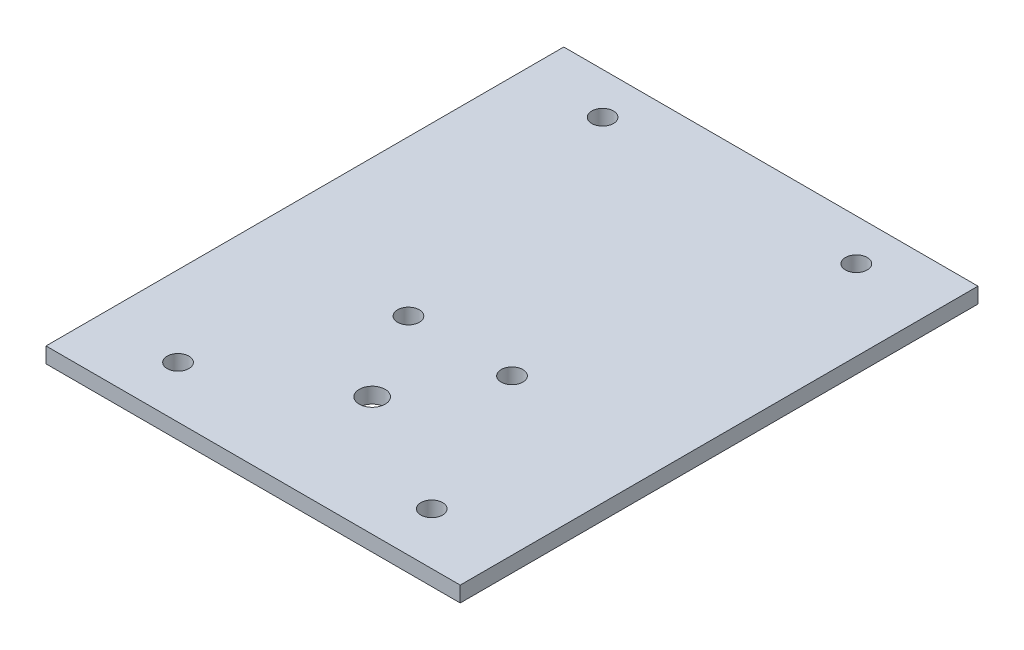
ISO-10303-21;
HEADER;
FILE_DESCRIPTION(('STEP AP214'),'2;1');
FILE_NAME('part.step','',(''),(''),'','','');
FILE_SCHEMA(('AUTOMOTIVE_DESIGN { 1 0 10303 214 1 1 1 1 }'));
ENDSEC;
DATA;
#1=APPLICATION_CONTEXT('core data for automotive mechanical design processes');
#2=APPLICATION_PROTOCOL_DEFINITION('international standard','automotive_design',2000,#1);
#3=PRODUCT_CONTEXT('',#1,'mechanical');
#4=PRODUCT('Part','Part','',(#3));
#5=PRODUCT_RELATED_PRODUCT_CATEGORY('part','',(#4));
#6=PRODUCT_DEFINITION_FORMATION('','',#4);
#7=PRODUCT_DEFINITION_CONTEXT('part definition',#1,'design');
#8=PRODUCT_DEFINITION('design','',#6,#7);
#9=PRODUCT_DEFINITION_SHAPE('','',#8);
#10=(LENGTH_UNIT() NAMED_UNIT(*) SI_UNIT(.MILLI.,.METRE.));
#11=(NAMED_UNIT(*) PLANE_ANGLE_UNIT() SI_UNIT($,.RADIAN.));
#12=(NAMED_UNIT(*) SI_UNIT($,.STERADIAN.) SOLID_ANGLE_UNIT());
#13=UNCERTAINTY_MEASURE_WITH_UNIT(LENGTH_MEASURE(1.E-05),#10,'distance_accuracy_value','');
#14=(GEOMETRIC_REPRESENTATION_CONTEXT(3) GLOBAL_UNCERTAINTY_ASSIGNED_CONTEXT((#13)) GLOBAL_UNIT_ASSIGNED_CONTEXT((#10,
#11,#12)) REPRESENTATION_CONTEXT('',''));
#15=CARTESIAN_POINT('',(0.,0.,0.));
#16=DIRECTION('',(0.,0.,1.));
#17=DIRECTION('',(1.,0.,0.));
#18=AXIS2_PLACEMENT_3D('',#15,#16,#17);
#19=CARTESIAN_POINT('',(0.,3.,0.));
#20=DIRECTION('',(0.,1.,0.));
#21=DIRECTION('',(0.,0.,1.));
#22=AXIS2_PLACEMENT_3D('',#19,#20,#21);
#23=PLANE('',#22);
#24=CARTESIAN_POINT('',(10.,3.,10.));
#25=DIRECTION('',(0.,1.,0.));
#26=DIRECTION('',(0.,0.,1.));
#27=AXIS2_PLACEMENT_3D('',#24,#25,#26);
#28=CIRCLE('',#27,2.1);
#29=CARTESIAN_POINT('',(10.,3.,12.1));
#30=VERTEX_POINT('',#29);
#31=EDGE_CURVE('E139',#30,#30,#28,.T.);
#32=ORIENTED_EDGE('',*,*,#31,.F.);
#33=EDGE_LOOP('',(#32));
#34=FACE_BOUND('',#33,.T.);
#35=CARTESIAN_POINT('',(24.5,3.,40.));
#36=DIRECTION('',(0.,1.,0.));
#37=DIRECTION('',(0.,0.,1.));
#38=AXIS2_PLACEMENT_3D('',#35,#36,#37);
#39=CIRCLE('',#38,2.1);
#40=CARTESIAN_POINT('',(24.5,3.,42.1));
#41=VERTEX_POINT('',#40);
#42=EDGE_CURVE('E127',#41,#41,#39,.T.);
#43=ORIENTED_EDGE('',*,*,#42,.F.);
#44=EDGE_LOOP('',(#43));
#45=FACE_BOUND('',#44,.T.);
#46=CARTESIAN_POINT('',(-24.5,3.,-42.));
#47=DIRECTION('',(0.,1.,0.));
#48=DIRECTION('',(0.,0.,1.));
#49=AXIS2_PLACEMENT_3D('',#46,#47,#48);
#50=CIRCLE('',#49,2.1);
#51=CARTESIAN_POINT('',(-24.5,3.,-39.9));
#52=VERTEX_POINT('',#51);
#53=EDGE_CURVE('E115',#52,#52,#50,.T.);
#54=ORIENTED_EDGE('',*,*,#53,.F.);
#55=EDGE_LOOP('',(#54));
#56=FACE_BOUND('',#55,.T.);
#57=DIRECTION('',(0.,0.,-1.));
#58=VECTOR('',#57,1.);
#59=CARTESIAN_POINT('',(40.,3.,-50.));
#60=LINE('',#59,#58);
#61=CARTESIAN_POINT('',(40.,3.,50.));
#62=VERTEX_POINT('',#61);
#63=CARTESIAN_POINT('',(40.,3.,-50.));
#64=VERTEX_POINT('',#63);
#65=EDGE_CURVE('E85',#62,#64,#60,.T.);
#66=ORIENTED_EDGE('',*,*,#65,.T.);
#67=DIRECTION('',(-1.,0.,0.));
#68=VECTOR('',#67,1.);
#69=CARTESIAN_POINT('',(-40.,3.,-50.));
#70=LINE('',#69,#68);
#71=CARTESIAN_POINT('',(-40.,3.,-50.));
#72=VERTEX_POINT('',#71);
#73=EDGE_CURVE('E80',#64,#72,#70,.T.);
#74=ORIENTED_EDGE('',*,*,#73,.T.);
#75=DIRECTION('',(0.,0.,1.));
#76=VECTOR('',#75,1.);
#77=CARTESIAN_POINT('',(-40.,3.,-50.));
#78=LINE('',#77,#76);
#79=CARTESIAN_POINT('',(-40.,3.,50.));
#80=VERTEX_POINT('',#79);
#81=EDGE_CURVE('E83',#72,#80,#78,.T.);
#82=ORIENTED_EDGE('',*,*,#81,.T.);
#83=DIRECTION('',(1.,0.,0.));
#84=VECTOR('',#83,1.);
#85=CARTESIAN_POINT('',(-40.,3.,50.));
#86=LINE('',#85,#84);
#87=EDGE_CURVE('E50',#80,#62,#86,.T.);
#88=ORIENTED_EDGE('',*,*,#87,.T.);
#89=EDGE_LOOP('',(#66,#74,#82,#88));
#90=FACE_BOUND('',#89,.T.);
#91=CARTESIAN_POINT('',(0.,3.,27.));
#92=DIRECTION('',(0.,1.,0.));
#93=DIRECTION('',(0.,0.,1.));
#94=AXIS2_PLACEMENT_3D('',#91,#92,#93);
#95=CIRCLE('',#94,2.5);
#96=CARTESIAN_POINT('',(0.,3.,29.5));
#97=VERTEX_POINT('',#96);
#98=EDGE_CURVE('E100',#97,#97,#95,.T.);
#99=ORIENTED_EDGE('',*,*,#98,.F.);
#100=EDGE_LOOP('',(#99));
#101=FACE_BOUND('',#100,.T.);
#102=CARTESIAN_POINT('',(24.5,3.,-42.));
#103=DIRECTION('',(0.,1.,0.));
#104=DIRECTION('',(0.,0.,-1.));
#105=AXIS2_PLACEMENT_3D('',#102,#103,#104);
#106=CIRCLE('',#105,2.1);
#107=CARTESIAN_POINT('',(24.5,3.,-44.1));
#108=VERTEX_POINT('',#107);
#109=EDGE_CURVE('E121',#108,#108,#106,.T.);
#110=ORIENTED_EDGE('',*,*,#109,.F.);
#111=EDGE_LOOP('',(#110));
#112=FACE_BOUND('',#111,.T.);
#113=CARTESIAN_POINT('',(-24.5,3.,40.));
#114=DIRECTION('',(0.,1.,0.));
#115=DIRECTION('',(0.,0.,1.));
#116=AXIS2_PLACEMENT_3D('',#113,#114,#115);
#117=CIRCLE('',#116,2.1);
#118=CARTESIAN_POINT('',(-24.5,3.,42.1));
#119=VERTEX_POINT('',#118);
#120=EDGE_CURVE('E133',#119,#119,#117,.T.);
#121=ORIENTED_EDGE('',*,*,#120,.F.);
#122=EDGE_LOOP('',(#121));
#123=FACE_BOUND('',#122,.T.);
#124=CARTESIAN_POINT('',(-10.,3.,10.));
#125=DIRECTION('',(0.,1.,0.));
#126=DIRECTION('',(0.,0.,1.));
#127=AXIS2_PLACEMENT_3D('',#124,#125,#126);
#128=CIRCLE('',#127,2.1);
#129=CARTESIAN_POINT('',(-10.,3.,12.1));
#130=VERTEX_POINT('',#129);
#131=EDGE_CURVE('E145',#130,#130,#128,.T.);
#132=ORIENTED_EDGE('',*,*,#131,.F.);
#133=EDGE_LOOP('',(#132));
#134=FACE_BOUND('',#133,.T.);
#135=ADVANCED_FACE('F33',(#34,#45,#56,#90,#101,#112,#123,#134),#23,.T.);
#136=CARTESIAN_POINT('',(0.,0.,0.));
#137=DIRECTION('',(0.,1.,0.));
#138=DIRECTION('',(0.,0.,1.));
#139=AXIS2_PLACEMENT_3D('',#136,#137,#138);
#140=PLANE('',#139);
#141=DIRECTION('',(0.,0.,-1.));
#142=VECTOR('',#141,1.);
#143=CARTESIAN_POINT('',(40.,0.,-50.));
#144=LINE('',#143,#142);
#145=CARTESIAN_POINT('',(40.,0.,50.));
#146=VERTEX_POINT('',#145);
#147=CARTESIAN_POINT('',(40.,0.,-50.));
#148=VERTEX_POINT('',#147);
#149=EDGE_CURVE('E97',#146,#148,#144,.T.);
#150=ORIENTED_EDGE('',*,*,#149,.F.);
#151=DIRECTION('',(1.,0.,0.));
#152=VECTOR('',#151,1.);
#153=CARTESIAN_POINT('',(-40.,0.,50.));
#154=LINE('',#153,#152);
#155=CARTESIAN_POINT('',(-40.,0.,50.));
#156=VERTEX_POINT('',#155);
#157=EDGE_CURVE('E73',#156,#146,#154,.T.);
#158=ORIENTED_EDGE('',*,*,#157,.F.);
#159=DIRECTION('',(0.,0.,1.));
#160=VECTOR('',#159,1.);
#161=CARTESIAN_POINT('',(-40.,0.,-50.));
#162=LINE('',#161,#160);
#163=CARTESIAN_POINT('',(-40.,0.,-50.));
#164=VERTEX_POINT('',#163);
#165=EDGE_CURVE('E67',#164,#156,#162,.T.);
#166=ORIENTED_EDGE('',*,*,#165,.F.);
#167=DIRECTION('',(-1.,0.,0.));
#168=VECTOR('',#167,1.);
#169=CARTESIAN_POINT('',(-40.,0.,-50.));
#170=LINE('',#169,#168);
#171=EDGE_CURVE('E89',#148,#164,#170,.T.);
#172=ORIENTED_EDGE('',*,*,#171,.F.);
#173=EDGE_LOOP('',(#150,#158,#166,#172));
#174=FACE_BOUND('',#173,.T.);
#175=CARTESIAN_POINT('',(0.,0.,27.));
#176=DIRECTION('',(0.,1.,0.));
#177=DIRECTION('',(0.,0.,1.));
#178=AXIS2_PLACEMENT_3D('',#175,#176,#177);
#179=CIRCLE('',#178,2.5);
#180=CARTESIAN_POINT('',(0.,0.,29.5));
#181=VERTEX_POINT('',#180);
#182=EDGE_CURVE('E112',#181,#181,#179,.T.);
#183=ORIENTED_EDGE('',*,*,#182,.T.);
#184=EDGE_LOOP('',(#183));
#185=FACE_BOUND('',#184,.T.);
#186=CARTESIAN_POINT('',(-24.5,0.,-42.));
#187=DIRECTION('',(0.,1.,0.));
#188=DIRECTION('',(0.,0.,1.));
#189=AXIS2_PLACEMENT_3D('',#186,#187,#188);
#190=CIRCLE('',#189,2.1);
#191=CARTESIAN_POINT('',(-24.5,0.,-39.9));
#192=VERTEX_POINT('',#191);
#193=EDGE_CURVE('E118',#192,#192,#190,.T.);
#194=ORIENTED_EDGE('',*,*,#193,.T.);
#195=EDGE_LOOP('',(#194));
#196=FACE_BOUND('',#195,.T.);
#197=CARTESIAN_POINT('',(24.5,0.,-42.));
#198=DIRECTION('',(0.,1.,0.));
#199=DIRECTION('',(0.,0.,-1.));
#200=AXIS2_PLACEMENT_3D('',#197,#198,#199);
#201=CIRCLE('',#200,2.1);
#202=CARTESIAN_POINT('',(24.5,0.,-44.1));
#203=VERTEX_POINT('',#202);
#204=EDGE_CURVE('E124',#203,#203,#201,.T.);
#205=ORIENTED_EDGE('',*,*,#204,.T.);
#206=EDGE_LOOP('',(#205));
#207=FACE_BOUND('',#206,.T.);
#208=CARTESIAN_POINT('',(24.5,0.,40.));
#209=DIRECTION('',(0.,1.,0.));
#210=DIRECTION('',(0.,0.,1.));
#211=AXIS2_PLACEMENT_3D('',#208,#209,#210);
#212=CIRCLE('',#211,2.1);
#213=CARTESIAN_POINT('',(24.5,0.,42.1));
#214=VERTEX_POINT('',#213);
#215=EDGE_CURVE('E130',#214,#214,#212,.T.);
#216=ORIENTED_EDGE('',*,*,#215,.T.);
#217=EDGE_LOOP('',(#216));
#218=FACE_BOUND('',#217,.T.);
#219=CARTESIAN_POINT('',(-24.5,0.,40.));
#220=DIRECTION('',(0.,1.,0.));
#221=DIRECTION('',(0.,0.,1.));
#222=AXIS2_PLACEMENT_3D('',#219,#220,#221);
#223=CIRCLE('',#222,2.1);
#224=CARTESIAN_POINT('',(-24.5,0.,42.1));
#225=VERTEX_POINT('',#224);
#226=EDGE_CURVE('E136',#225,#225,#223,.T.);
#227=ORIENTED_EDGE('',*,*,#226,.T.);
#228=EDGE_LOOP('',(#227));
#229=FACE_BOUND('',#228,.T.);
#230=CARTESIAN_POINT('',(10.,0.,10.));
#231=DIRECTION('',(0.,1.,0.));
#232=DIRECTION('',(0.,0.,1.));
#233=AXIS2_PLACEMENT_3D('',#230,#231,#232);
#234=CIRCLE('',#233,2.1);
#235=CARTESIAN_POINT('',(10.,0.,12.1));
#236=VERTEX_POINT('',#235);
#237=EDGE_CURVE('E142',#236,#236,#234,.T.);
#238=ORIENTED_EDGE('',*,*,#237,.T.);
#239=EDGE_LOOP('',(#238));
#240=FACE_BOUND('',#239,.T.);
#241=CARTESIAN_POINT('',(-10.,0.,10.));
#242=DIRECTION('',(0.,1.,0.));
#243=DIRECTION('',(0.,0.,1.));
#244=AXIS2_PLACEMENT_3D('',#241,#242,#243);
#245=CIRCLE('',#244,2.1);
#246=CARTESIAN_POINT('',(-10.,0.,12.1));
#247=VERTEX_POINT('',#246);
#248=EDGE_CURVE('E148',#247,#247,#245,.T.);
#249=ORIENTED_EDGE('',*,*,#248,.T.);
#250=EDGE_LOOP('',(#249));
#251=FACE_BOUND('',#250,.T.);
#252=ADVANCED_FACE('F108',(#174,#185,#196,#207,#218,#229,#240,#251),#140,.F.);
#253=CARTESIAN_POINT('',(40.,3.,-50.));
#254=DIRECTION('',(-1.,0.,0.));
#255=DIRECTION('',(0.,0.,1.));
#256=AXIS2_PLACEMENT_3D('',#253,#254,#255);
#257=PLANE('',#256);
#258=ORIENTED_EDGE('',*,*,#149,.T.);
#259=DIRECTION('',(0.,-1.,0.));
#260=VECTOR('',#259,1.);
#261=CARTESIAN_POINT('',(40.,3.,-50.));
#262=LINE('',#261,#260);
#263=EDGE_CURVE('E11',#64,#148,#262,.T.);
#264=ORIENTED_EDGE('',*,*,#263,.F.);
#265=ORIENTED_EDGE('',*,*,#65,.F.);
#266=DIRECTION('',(0.,-1.,0.));
#267=VECTOR('',#266,1.);
#268=CARTESIAN_POINT('',(40.,3.,50.));
#269=LINE('',#268,#267);
#270=EDGE_CURVE('E93',#62,#146,#269,.T.);
#271=ORIENTED_EDGE('',*,*,#270,.T.);
#272=EDGE_LOOP('',(#258,#264,#265,#271));
#273=FACE_BOUND('',#272,.T.);
#274=ADVANCED_FACE('F35',(#273),#257,.F.);
#275=CARTESIAN_POINT('',(-40.,3.,-50.));
#276=DIRECTION('',(0.,0.,1.));
#277=DIRECTION('',(1.,0.,0.));
#278=AXIS2_PLACEMENT_3D('',#275,#276,#277);
#279=PLANE('',#278);
#280=ORIENTED_EDGE('',*,*,#171,.T.);
#281=DIRECTION('',(0.,-1.,0.));
#282=VECTOR('',#281,1.);
#283=CARTESIAN_POINT('',(-40.,3.,-50.));
#284=LINE('',#283,#282);
#285=EDGE_CURVE('E42',#72,#164,#284,.T.);
#286=ORIENTED_EDGE('',*,*,#285,.F.);
#287=ORIENTED_EDGE('',*,*,#73,.F.);
#288=ORIENTED_EDGE('',*,*,#263,.T.);
#289=EDGE_LOOP('',(#280,#286,#287,#288));
#290=FACE_BOUND('',#289,.T.);
#291=ADVANCED_FACE('F88',(#290),#279,.F.);
#292=CARTESIAN_POINT('',(-40.,3.,-50.));
#293=DIRECTION('',(1.,0.,0.));
#294=DIRECTION('',(0.,0.,-1.));
#295=AXIS2_PLACEMENT_3D('',#292,#293,#294);
#296=PLANE('',#295);
#297=ORIENTED_EDGE('',*,*,#165,.T.);
#298=DIRECTION('',(0.,-1.,0.));
#299=VECTOR('',#298,1.);
#300=CARTESIAN_POINT('',(-40.,3.,50.));
#301=LINE('',#300,#299);
#302=EDGE_CURVE('E90',#80,#156,#301,.T.);
#303=ORIENTED_EDGE('',*,*,#302,.F.);
#304=ORIENTED_EDGE('',*,*,#81,.F.);
#305=ORIENTED_EDGE('',*,*,#285,.T.);
#306=EDGE_LOOP('',(#297,#303,#304,#305));
#307=FACE_BOUND('',#306,.T.);
#308=ADVANCED_FACE('F91',(#307),#296,.F.);
#309=CARTESIAN_POINT('',(-40.,3.,50.));
#310=DIRECTION('',(0.,0.,-1.));
#311=DIRECTION('',(-1.,0.,0.));
#312=AXIS2_PLACEMENT_3D('',#309,#310,#311);
#313=PLANE('',#312);
#314=ORIENTED_EDGE('',*,*,#157,.T.);
#315=ORIENTED_EDGE('',*,*,#270,.F.);
#316=ORIENTED_EDGE('',*,*,#87,.F.);
#317=ORIENTED_EDGE('',*,*,#302,.T.);
#318=EDGE_LOOP('',(#314,#315,#316,#317));
#319=FACE_BOUND('',#318,.T.);
#320=ADVANCED_FACE('F105',(#319),#313,.F.);
#321=CARTESIAN_POINT('',(0.,3.,27.));
#322=DIRECTION('',(0.,-1.,0.));
#323=DIRECTION('',(0.,0.,-1.));
#324=AXIS2_PLACEMENT_3D('',#321,#322,#323);
#325=CYLINDRICAL_SURFACE('',#324,2.5);
#326=ORIENTED_EDGE('',*,*,#98,.T.);
#327=EDGE_LOOP('',(#326));
#328=FACE_BOUND('',#327,.T.);
#329=ORIENTED_EDGE('',*,*,#182,.F.);
#330=EDGE_LOOP('',(#329));
#331=FACE_BOUND('',#330,.T.);
#332=ADVANCED_FACE('F167',(#328,#331),#325,.F.);
#333=CARTESIAN_POINT('',(-24.5,3.,-42.));
#334=DIRECTION('',(0.,-1.,0.));
#335=DIRECTION('',(0.,0.,-1.));
#336=AXIS2_PLACEMENT_3D('',#333,#334,#335);
#337=CYLINDRICAL_SURFACE('',#336,2.1);
#338=ORIENTED_EDGE('',*,*,#53,.T.);
#339=EDGE_LOOP('',(#338));
#340=FACE_BOUND('',#339,.T.);
#341=ORIENTED_EDGE('',*,*,#193,.F.);
#342=EDGE_LOOP('',(#341));
#343=FACE_BOUND('',#342,.T.);
#344=ADVANCED_FACE('F213',(#340,#343),#337,.F.);
#345=CARTESIAN_POINT('',(24.5,3.,-42.));
#346=DIRECTION('',(0.,-1.,0.));
#347=DIRECTION('',(0.,0.,-1.));
#348=AXIS2_PLACEMENT_3D('',#345,#346,#347);
#349=CYLINDRICAL_SURFACE('',#348,2.1);
#350=ORIENTED_EDGE('',*,*,#109,.T.);
#351=EDGE_LOOP('',(#350));
#352=FACE_BOUND('',#351,.T.);
#353=ORIENTED_EDGE('',*,*,#204,.F.);
#354=EDGE_LOOP('',(#353));
#355=FACE_BOUND('',#354,.T.);
#356=ADVANCED_FACE('F221',(#352,#355),#349,.F.);
#357=CARTESIAN_POINT('',(24.5,3.,40.));
#358=DIRECTION('',(0.,-1.,0.));
#359=DIRECTION('',(0.,0.,-1.));
#360=AXIS2_PLACEMENT_3D('',#357,#358,#359);
#361=CYLINDRICAL_SURFACE('',#360,2.1);
#362=ORIENTED_EDGE('',*,*,#42,.T.);
#363=EDGE_LOOP('',(#362));
#364=FACE_BOUND('',#363,.T.);
#365=ORIENTED_EDGE('',*,*,#215,.F.);
#366=EDGE_LOOP('',(#365));
#367=FACE_BOUND('',#366,.T.);
#368=ADVANCED_FACE('F229',(#364,#367),#361,.F.);
#369=CARTESIAN_POINT('',(-24.5,3.,40.));
#370=DIRECTION('',(0.,-1.,0.));
#371=DIRECTION('',(0.,0.,-1.));
#372=AXIS2_PLACEMENT_3D('',#369,#370,#371);
#373=CYLINDRICAL_SURFACE('',#372,2.1);
#374=ORIENTED_EDGE('',*,*,#120,.T.);
#375=EDGE_LOOP('',(#374));
#376=FACE_BOUND('',#375,.T.);
#377=ORIENTED_EDGE('',*,*,#226,.F.);
#378=EDGE_LOOP('',(#377));
#379=FACE_BOUND('',#378,.T.);
#380=ADVANCED_FACE('F238',(#376,#379),#373,.F.);
#381=CARTESIAN_POINT('',(10.,3.,10.));
#382=DIRECTION('',(0.,-1.,0.));
#383=DIRECTION('',(0.,0.,-1.));
#384=AXIS2_PLACEMENT_3D('',#381,#382,#383);
#385=CYLINDRICAL_SURFACE('',#384,2.1);
#386=ORIENTED_EDGE('',*,*,#31,.T.);
#387=EDGE_LOOP('',(#386));
#388=FACE_BOUND('',#387,.T.);
#389=ORIENTED_EDGE('',*,*,#237,.F.);
#390=EDGE_LOOP('',(#389));
#391=FACE_BOUND('',#390,.T.);
#392=ADVANCED_FACE('F247',(#388,#391),#385,.F.);
#393=CARTESIAN_POINT('',(-10.,3.,10.));
#394=DIRECTION('',(0.,-1.,0.));
#395=DIRECTION('',(0.,0.,-1.));
#396=AXIS2_PLACEMENT_3D('',#393,#394,#395);
#397=CYLINDRICAL_SURFACE('',#396,2.1);
#398=ORIENTED_EDGE('',*,*,#131,.T.);
#399=EDGE_LOOP('',(#398));
#400=FACE_BOUND('',#399,.T.);
#401=ORIENTED_EDGE('',*,*,#248,.F.);
#402=EDGE_LOOP('',(#401));
#403=FACE_BOUND('',#402,.T.);
#404=ADVANCED_FACE('F154',(#400,#403),#397,.F.);
#405=CLOSED_SHELL('',(#135,#252,#274,#291,#308,#320,#332,#344,#356,#368,#380,#392,#404));
#406=MANIFOLD_SOLID_BREP('B2',#405);
#407=ADVANCED_BREP_SHAPE_REPRESENTATION('',(#18,#406),#14);
#408=SHAPE_DEFINITION_REPRESENTATION(#9,#407);
ENDSEC;
END-ISO-10303-21;
